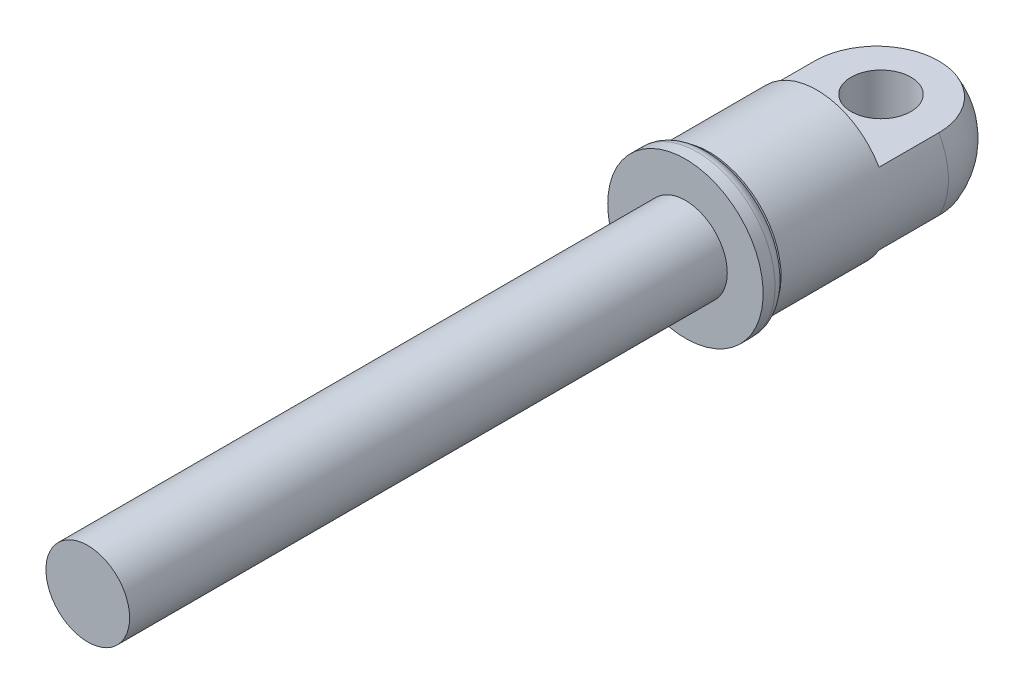
ISO-10303-21;
HEADER;
FILE_DESCRIPTION(('STEP AP214'),'2;1');
FILE_NAME('part.step','',(''),(''),'','','');
FILE_SCHEMA(('AUTOMOTIVE_DESIGN { 1 0 10303 214 1 1 1 1 }'));
ENDSEC;
DATA;
#1=APPLICATION_CONTEXT('core data for automotive mechanical design processes');
#2=APPLICATION_PROTOCOL_DEFINITION('international standard','automotive_design',2000,#1);
#3=PRODUCT_CONTEXT('',#1,'mechanical');
#4=PRODUCT('Part','Part','',(#3));
#5=PRODUCT_RELATED_PRODUCT_CATEGORY('part','',(#4));
#6=PRODUCT_DEFINITION_FORMATION('','',#4);
#7=PRODUCT_DEFINITION_CONTEXT('part definition',#1,'design');
#8=PRODUCT_DEFINITION('design','',#6,#7);
#9=PRODUCT_DEFINITION_SHAPE('','',#8);
#10=(LENGTH_UNIT() NAMED_UNIT(*) SI_UNIT(.MILLI.,.METRE.));
#11=(NAMED_UNIT(*) PLANE_ANGLE_UNIT() SI_UNIT($,.RADIAN.));
#12=(NAMED_UNIT(*) SI_UNIT($,.STERADIAN.) SOLID_ANGLE_UNIT());
#13=UNCERTAINTY_MEASURE_WITH_UNIT(LENGTH_MEASURE(1.E-05),#10,'distance_accuracy_value','');
#14=(GEOMETRIC_REPRESENTATION_CONTEXT(3) GLOBAL_UNCERTAINTY_ASSIGNED_CONTEXT((#13)) GLOBAL_UNIT_ASSIGNED_CONTEXT((#10,
#11,#12)) REPRESENTATION_CONTEXT('',''));
#15=CARTESIAN_POINT('',(0.,0.,0.));
#16=DIRECTION('',(0.,0.,1.));
#17=DIRECTION('',(1.,0.,0.));
#18=AXIS2_PLACEMENT_3D('',#15,#16,#17);
#19=CARTESIAN_POINT('',(0.,0.,-22.));
#20=DIRECTION('',(0.,0.,1.));
#21=DIRECTION('',(1.,0.,0.));
#22=AXIS2_PLACEMENT_3D('',#19,#20,#21);
#23=CYLINDRICAL_SURFACE('',#22,6.);
#24=CARTESIAN_POINT('',(0.,0.,-2.));
#25=DIRECTION('',(0.,0.,-1.));
#26=DIRECTION('',(-1.,0.,0.));
#27=AXIS2_PLACEMENT_3D('',#24,#25,#26);
#28=CIRCLE('',#27,6.);
#29=CARTESIAN_POINT('',(-6.,0.,-2.));
#30=VERTEX_POINT('',#29);
#31=EDGE_CURVE('E91',#30,#30,#28,.T.);
#32=ORIENTED_EDGE('',*,*,#31,.T.);
#33=EDGE_LOOP('',(#32));
#34=FACE_BOUND('',#33,.T.);
#35=DIRECTION('',(0.,0.,-1.));
#36=VECTOR('',#35,1.);
#37=CARTESIAN_POINT('',(-5.19615242270663,3.,-11.));
#38=LINE('',#37,#36);
#39=CARTESIAN_POINT('',(-5.19615242270663,3.,-11.));
#40=VERTEX_POINT('',#39);
#41=CARTESIAN_POINT('',(-5.19615242270663,3.,-16.));
#42=VERTEX_POINT('',#41);
#43=EDGE_CURVE('E86',#40,#42,#38,.T.);
#44=ORIENTED_EDGE('',*,*,#43,.T.);
#45=CARTESIAN_POINT('',(0.,0.,-16.));
#46=DIRECTION('',(0.,0.,1.));
#47=DIRECTION('',(1.,0.,0.));
#48=AXIS2_PLACEMENT_3D('',#45,#46,#47);
#49=CIRCLE('',#48,6.);
#50=CARTESIAN_POINT('',(-5.19615242270663,-3.,-16.));
#51=VERTEX_POINT('',#50);
#52=EDGE_CURVE('E121',#42,#51,#49,.T.);
#53=ORIENTED_EDGE('',*,*,#52,.T.);
#54=DIRECTION('',(0.,0.,-1.));
#55=VECTOR('',#54,1.);
#56=CARTESIAN_POINT('',(-5.19615242270663,-3.,-11.));
#57=LINE('',#56,#55);
#58=CARTESIAN_POINT('',(-5.19615242270663,-3.,-11.));
#59=VERTEX_POINT('',#58);
#60=EDGE_CURVE('E80',#59,#51,#57,.T.);
#61=ORIENTED_EDGE('',*,*,#60,.F.);
#62=CARTESIAN_POINT('',(0.,0.,-11.));
#63=DIRECTION('',(0.,0.,-1.));
#64=DIRECTION('',(-1.,0.,0.));
#65=AXIS2_PLACEMENT_3D('',#62,#63,#64);
#66=CIRCLE('',#65,6.);
#67=CARTESIAN_POINT('',(5.19615242270663,-3.,-11.));
#68=VERTEX_POINT('',#67);
#69=EDGE_CURVE('E81',#68,#59,#66,.T.);
#70=ORIENTED_EDGE('',*,*,#69,.F.);
#71=DIRECTION('',(0.,0.,-1.));
#72=VECTOR('',#71,1.);
#73=CARTESIAN_POINT('',(5.19615242270663,-3.,-11.));
#74=LINE('',#73,#72);
#75=CARTESIAN_POINT('',(5.19615242270663,-3.,-16.));
#76=VERTEX_POINT('',#75);
#77=EDGE_CURVE('E72',#68,#76,#74,.T.);
#78=ORIENTED_EDGE('',*,*,#77,.T.);
#79=CARTESIAN_POINT('',(0.,0.,-16.));
#80=DIRECTION('',(0.,0.,1.));
#81=DIRECTION('',(1.,0.,0.));
#82=AXIS2_PLACEMENT_3D('',#79,#80,#81);
#83=CIRCLE('',#82,6.);
#84=CARTESIAN_POINT('',(5.19615242270663,3.,-16.));
#85=VERTEX_POINT('',#84);
#86=EDGE_CURVE('E119',#76,#85,#83,.T.);
#87=ORIENTED_EDGE('',*,*,#86,.T.);
#88=DIRECTION('',(0.,0.,-1.));
#89=VECTOR('',#88,1.);
#90=CARTESIAN_POINT('',(5.19615242270663,3.,-11.));
#91=LINE('',#90,#89);
#92=CARTESIAN_POINT('',(5.19615242270663,3.,-11.));
#93=VERTEX_POINT('',#92);
#94=EDGE_CURVE('E99',#93,#85,#91,.T.);
#95=ORIENTED_EDGE('',*,*,#94,.F.);
#96=CARTESIAN_POINT('',(0.,0.,-11.));
#97=DIRECTION('',(0.,0.,-1.));
#98=DIRECTION('',(-1.,0.,0.));
#99=AXIS2_PLACEMENT_3D('',#96,#97,#98);
#100=CIRCLE('',#99,6.);
#101=EDGE_CURVE('E93',#40,#93,#100,.T.);
#102=ORIENTED_EDGE('',*,*,#101,.F.);
#103=EDGE_LOOP('',(#44,#53,#61,#70,#78,#87,#95,#102));
#104=FACE_BOUND('',#103,.T.);
#105=ADVANCED_FACE('F33',(#34,#104),#23,.T.);
#106=CARTESIAN_POINT('',(0.,0.,50.));
#107=DIRECTION('',(0.,0.,-1.));
#108=DIRECTION('',(-1.,0.,0.));
#109=AXIS2_PLACEMENT_3D('',#106,#107,#108);
#110=CYLINDRICAL_SURFACE('',#109,3.5);
#111=CARTESIAN_POINT('',(0.,0.,50.));
#112=DIRECTION('',(0.,0.,1.));
#113=DIRECTION('',(1.,0.,0.));
#114=AXIS2_PLACEMENT_3D('',#111,#112,#113);
#115=CIRCLE('',#114,3.5);
#116=CARTESIAN_POINT('',(3.5,0.,50.));
#117=VERTEX_POINT('',#116);
#118=EDGE_CURVE('E108',#117,#117,#115,.T.);
#119=ORIENTED_EDGE('',*,*,#118,.F.);
#120=EDGE_LOOP('',(#119));
#121=FACE_BOUND('',#120,.T.);
#122=CARTESIAN_POINT('',(0.,0.,0.));
#123=DIRECTION('',(0.,0.,1.));
#124=DIRECTION('',(1.,0.,0.));
#125=AXIS2_PLACEMENT_3D('',#122,#123,#124);
#126=CIRCLE('',#125,3.5);
#127=CARTESIAN_POINT('',(3.5,0.,0.));
#128=VERTEX_POINT('',#127);
#129=EDGE_CURVE('E107',#128,#128,#126,.T.);
#130=ORIENTED_EDGE('',*,*,#129,.T.);
#131=EDGE_LOOP('',(#130));
#132=FACE_BOUND('',#131,.T.);
#133=ADVANCED_FACE('F140',(#121,#132),#110,.T.);
#134=CARTESIAN_POINT('',(0.,0.,50.));
#135=DIRECTION('',(0.,0.,1.));
#136=DIRECTION('',(1.,0.,0.));
#137=AXIS2_PLACEMENT_3D('',#134,#135,#136);
#138=PLANE('',#137);
#139=ORIENTED_EDGE('',*,*,#118,.T.);
#140=EDGE_LOOP('',(#139));
#141=FACE_BOUND('',#140,.T.);
#142=ADVANCED_FACE('F146',(#141),#138,.T.);
#143=CARTESIAN_POINT('',(0.,0.,-2.));
#144=DIRECTION('',(0.,0.,1.));
#145=DIRECTION('',(1.,0.,0.));
#146=AXIS2_PLACEMENT_3D('',#143,#144,#145);
#147=CYLINDRICAL_SURFACE('',#146,6.5);
#148=CARTESIAN_POINT('',(0.,0.,-1.));
#149=DIRECTION('',(0.,0.,-1.));
#150=DIRECTION('',(-1.,0.,0.));
#151=AXIS2_PLACEMENT_3D('',#148,#149,#150);
#152=CIRCLE('',#151,6.5);
#153=CARTESIAN_POINT('',(-6.5,0.,-1.));
#154=VERTEX_POINT('',#153);
#155=EDGE_CURVE('E116',#154,#154,#152,.F.);
#156=ORIENTED_EDGE('',*,*,#155,.T.);
#157=EDGE_LOOP('',(#156));
#158=FACE_BOUND('',#157,.T.);
#159=CARTESIAN_POINT('',(0.,0.,0.));
#160=DIRECTION('',(0.,0.,-1.));
#161=DIRECTION('',(-1.,0.,0.));
#162=AXIS2_PLACEMENT_3D('',#159,#160,#161);
#163=CIRCLE('',#162,6.5);
#164=CARTESIAN_POINT('',(-6.5,0.,0.));
#165=VERTEX_POINT('',#164);
#166=EDGE_CURVE('E104',#165,#165,#163,.T.);
#167=ORIENTED_EDGE('',*,*,#166,.T.);
#168=EDGE_LOOP('',(#167));
#169=FACE_BOUND('',#168,.T.);
#170=ADVANCED_FACE('F155',(#158,#169),#147,.T.);
#171=CARTESIAN_POINT('',(0.,0.,0.));
#172=DIRECTION('',(0.,0.,-1.));
#173=DIRECTION('',(-1.,0.,0.));
#174=AXIS2_PLACEMENT_3D('',#171,#172,#173);
#175=PLANE('',#174);
#176=ORIENTED_EDGE('',*,*,#129,.F.);
#177=EDGE_LOOP('',(#176));
#178=FACE_BOUND('',#177,.T.);
#179=ORIENTED_EDGE('',*,*,#166,.F.);
#180=EDGE_LOOP('',(#179));
#181=FACE_BOUND('',#180,.T.);
#182=ADVANCED_FACE('F151',(#178,#181),#175,.F.);
#183=CARTESIAN_POINT('',(0.,0.,-1.));
#184=DIRECTION('',(0.,0.,-1.));
#185=DIRECTION('',(-1.,0.,0.));
#186=AXIS2_PLACEMENT_3D('',#183,#184,#185);
#187=TOROIDAL_SURFACE('',#186,5.5,1.);
#188=ORIENTED_EDGE('',*,*,#155,.F.);
#189=EDGE_LOOP('',(#188));
#190=FACE_BOUND('',#189,.T.);
#191=CARTESIAN_POINT('',(0.,0.,-2.));
#192=DIRECTION('',(0.,0.,-1.));
#193=DIRECTION('',(-1.,0.,0.));
#194=AXIS2_PLACEMENT_3D('',#191,#192,#193);
#195=CIRCLE('',#194,5.5);
#196=CARTESIAN_POINT('',(-5.5,0.,-2.));
#197=VERTEX_POINT('',#196);
#198=EDGE_CURVE('E111',#197,#197,#195,.T.);
#199=ORIENTED_EDGE('',*,*,#198,.F.);
#200=EDGE_LOOP('',(#199));
#201=FACE_BOUND('',#200,.T.);
#202=ADVANCED_FACE('F154',(#190,#201),#187,.T.);
#203=CARTESIAN_POINT('',(0.,0.,-2.));
#204=DIRECTION('',(0.,0.,-1.));
#205=DIRECTION('',(-1.,0.,0.));
#206=AXIS2_PLACEMENT_3D('',#203,#204,#205);
#207=PLANE('',#206);
#208=ORIENTED_EDGE('',*,*,#198,.T.);
#209=EDGE_LOOP('',(#208));
#210=FACE_BOUND('',#209,.T.);
#211=ORIENTED_EDGE('',*,*,#31,.F.);
#212=EDGE_LOOP('',(#211));
#213=FACE_BOUND('',#212,.T.);
#214=ADVANCED_FACE('F136',(#210,#213),#207,.F.);
#215=CARTESIAN_POINT('',(0.,3.,-11.));
#216=DIRECTION('',(0.,-1.,0.));
#217=DIRECTION('',(0.,0.,-1.));
#218=AXIS2_PLACEMENT_3D('',#215,#216,#217);
#219=PLANE('',#218);
#220=CARTESIAN_POINT('',(0.,3.,-16.3590376744729));
#221=DIRECTION('',(0.,1.,0.));
#222=DIRECTION('',(-1.,0.,0.));
#223=AXIS2_PLACEMENT_3D('',#220,#221,#222);
#224=CIRCLE('',#223,2.5);
#225=CARTESIAN_POINT('',(-2.5,3.,-16.3590376744729));
#226=VERTEX_POINT('',#225);
#227=EDGE_CURVE('E258',#226,#226,#224,.T.);
#228=ORIENTED_EDGE('',*,*,#227,.F.);
#229=EDGE_LOOP('',(#228));
#230=FACE_BOUND('',#229,.T.);
#231=ORIENTED_EDGE('',*,*,#94,.T.);
#232=CARTESIAN_POINT('',(0.,3.,-16.));
#233=DIRECTION('',(0.,-1.,0.));
#234=DIRECTION('',(0.,0.,-1.));
#235=AXIS2_PLACEMENT_3D('',#232,#233,#234);
#236=CIRCLE('',#235,5.19615242270663);
#237=EDGE_CURVE('E11',#85,#42,#236,.F.);
#238=ORIENTED_EDGE('',*,*,#237,.T.);
#239=ORIENTED_EDGE('',*,*,#43,.F.);
#240=DIRECTION('',(-1.,0.,0.));
#241=VECTOR('',#240,1.);
#242=CARTESIAN_POINT('',(0.,3.,-11.));
#243=LINE('',#242,#241);
#244=EDGE_CURVE('E95',#93,#40,#243,.T.);
#245=ORIENTED_EDGE('',*,*,#244,.F.);
#246=EDGE_LOOP('',(#231,#238,#239,#245));
#247=FACE_BOUND('',#246,.T.);
#248=ADVANCED_FACE('F125',(#230,#247),#219,.F.);
#249=CARTESIAN_POINT('',(0.,0.,-11.));
#250=DIRECTION('',(0.,0.,-1.));
#251=DIRECTION('',(-1.,0.,0.));
#252=AXIS2_PLACEMENT_3D('',#249,#250,#251);
#253=PLANE('',#252);
#254=ORIENTED_EDGE('',*,*,#101,.T.);
#255=ORIENTED_EDGE('',*,*,#244,.T.);
#256=EDGE_LOOP('',(#254,#255));
#257=FACE_BOUND('',#256,.T.);
#258=ADVANCED_FACE('F127',(#257),#253,.T.);
#259=CARTESIAN_POINT('',(0.,-3.,-11.));
#260=DIRECTION('',(0.,-1.,0.));
#261=DIRECTION('',(0.,0.,-1.));
#262=AXIS2_PLACEMENT_3D('',#259,#260,#261);
#263=PLANE('',#262);
#264=CARTESIAN_POINT('',(0.,-3.,-16.3590376744729));
#265=DIRECTION('',(0.,-1.,0.));
#266=DIRECTION('',(0.,0.,-1.));
#267=AXIS2_PLACEMENT_3D('',#264,#265,#266);
#268=CIRCLE('',#267,2.5);
#269=CARTESIAN_POINT('',(0.,-3.,-18.8590376744729));
#270=VERTEX_POINT('',#269);
#271=EDGE_CURVE('E96',#270,#270,#268,.F.);
#272=ORIENTED_EDGE('',*,*,#271,.T.);
#273=EDGE_LOOP('',(#272));
#274=FACE_BOUND('',#273,.T.);
#275=ORIENTED_EDGE('',*,*,#60,.T.);
#276=CARTESIAN_POINT('',(0.,-3.,-16.));
#277=DIRECTION('',(0.,-1.,0.));
#278=DIRECTION('',(0.,0.,-1.));
#279=AXIS2_PLACEMENT_3D('',#276,#277,#278);
#280=CIRCLE('',#279,5.19615242270663);
#281=EDGE_CURVE('E41',#51,#76,#280,.T.);
#282=ORIENTED_EDGE('',*,*,#281,.T.);
#283=ORIENTED_EDGE('',*,*,#77,.F.);
#284=DIRECTION('',(-1.,0.,0.));
#285=VECTOR('',#284,1.);
#286=CARTESIAN_POINT('',(0.,-3.,-11.));
#287=LINE('',#286,#285);
#288=EDGE_CURVE('E76',#68,#59,#287,.T.);
#289=ORIENTED_EDGE('',*,*,#288,.T.);
#290=EDGE_LOOP('',(#275,#282,#283,#289));
#291=FACE_BOUND('',#290,.T.);
#292=ADVANCED_FACE('F75',(#274,#291),#263,.T.);
#293=CARTESIAN_POINT('',(0.,0.,-11.));
#294=DIRECTION('',(0.,0.,-1.));
#295=DIRECTION('',(-1.,0.,0.));
#296=AXIS2_PLACEMENT_3D('',#293,#294,#295);
#297=PLANE('',#296);
#298=ORIENTED_EDGE('',*,*,#288,.F.);
#299=ORIENTED_EDGE('',*,*,#69,.T.);
#300=EDGE_LOOP('',(#298,#299));
#301=FACE_BOUND('',#300,.T.);
#302=ADVANCED_FACE('F84',(#301),#297,.T.);
#303=CARTESIAN_POINT('',(0.,0.,-16.));
#304=DIRECTION('',(0.,0.,-1.));
#305=DIRECTION('',(-1.,0.,0.));
#306=AXIS2_PLACEMENT_3D('',#303,#304,#305);
#307=SPHERICAL_SURFACE('',#306,6.);
#308=ORIENTED_EDGE('',*,*,#281,.F.);
#309=ORIENTED_EDGE('',*,*,#52,.F.);
#310=ORIENTED_EDGE('',*,*,#237,.F.);
#311=ORIENTED_EDGE('',*,*,#86,.F.);
#312=EDGE_LOOP('',(#308,#309,#310,#311));
#313=FACE_BOUND('',#312,.T.);
#314=ADVANCED_FACE('F35',(#313),#307,.T.);
#315=CARTESIAN_POINT('',(0.,-10.0710678118655,-16.3590376744729));
#316=DIRECTION('',(0.,1.,0.));
#317=DIRECTION('',(-1.,0.,0.));
#318=AXIS2_PLACEMENT_3D('',#315,#316,#317);
#319=CYLINDRICAL_SURFACE('',#318,2.5);
#320=ORIENTED_EDGE('',*,*,#227,.T.);
#321=EDGE_LOOP('',(#320));
#322=FACE_BOUND('',#321,.T.);
#323=ORIENTED_EDGE('',*,*,#271,.F.);
#324=EDGE_LOOP('',(#323));
#325=FACE_BOUND('',#324,.T.);
#326=ADVANCED_FACE('F201',(#322,#325),#319,.F.);
#327=CLOSED_SHELL('',(#105,#133,#142,#170,#182,#202,#214,#248,#258,#292,#302,#314,#326));
#328=MANIFOLD_SOLID_BREP('B2',#327);
#329=ADVANCED_BREP_SHAPE_REPRESENTATION('',(#18,#328),#14);
#330=SHAPE_DEFINITION_REPRESENTATION(#9,#329);
ENDSEC;
END-ISO-10303-21;
